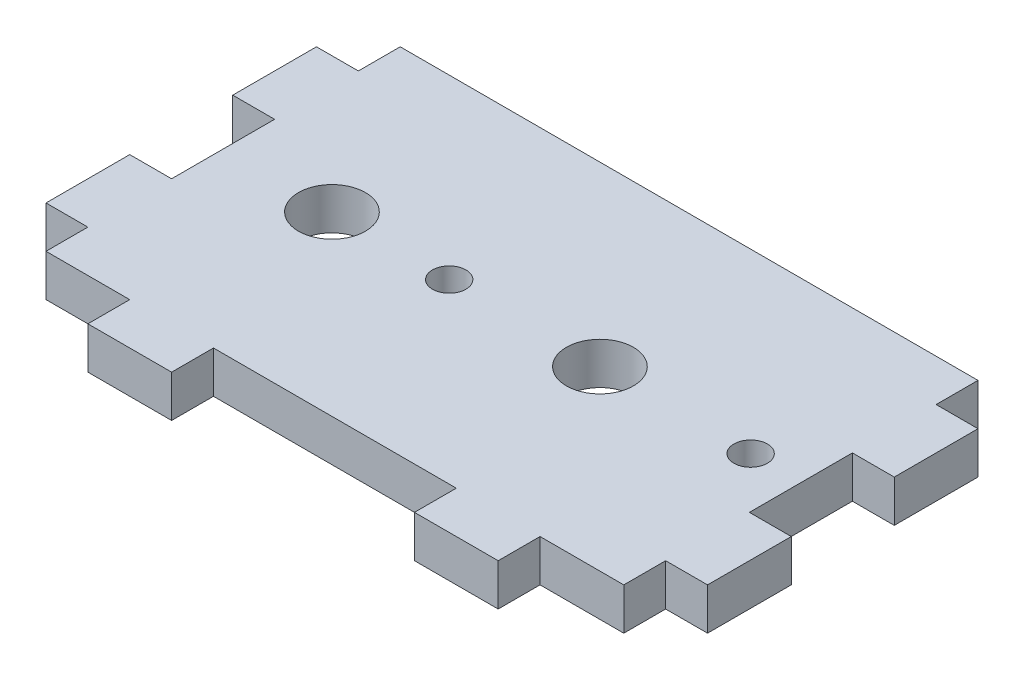
ISO-10303-21;
HEADER;
FILE_DESCRIPTION(('STEP AP214'),'2;1');
FILE_NAME('part.step','',(''),(''),'','','');
FILE_SCHEMA(('AUTOMOTIVE_DESIGN { 1 0 10303 214 1 1 1 1 }'));
ENDSEC;
DATA;
#1=APPLICATION_CONTEXT('core data for automotive mechanical design processes');
#2=APPLICATION_PROTOCOL_DEFINITION('international standard','automotive_design',2000,#1);
#3=PRODUCT_CONTEXT('',#1,'mechanical');
#4=PRODUCT('Part','Part','',(#3));
#5=PRODUCT_RELATED_PRODUCT_CATEGORY('part','',(#4));
#6=PRODUCT_DEFINITION_FORMATION('','',#4);
#7=PRODUCT_DEFINITION_CONTEXT('part definition',#1,'design');
#8=PRODUCT_DEFINITION('design','',#6,#7);
#9=PRODUCT_DEFINITION_SHAPE('','',#8);
#10=(LENGTH_UNIT() NAMED_UNIT(*) SI_UNIT(.MILLI.,.METRE.));
#11=(NAMED_UNIT(*) PLANE_ANGLE_UNIT() SI_UNIT($,.RADIAN.));
#12=(NAMED_UNIT(*) SI_UNIT($,.STERADIAN.) SOLID_ANGLE_UNIT());
#13=UNCERTAINTY_MEASURE_WITH_UNIT(LENGTH_MEASURE(1.E-05),#10,'distance_accuracy_value','');
#14=(GEOMETRIC_REPRESENTATION_CONTEXT(3) GLOBAL_UNCERTAINTY_ASSIGNED_CONTEXT((#13)) GLOBAL_UNIT_ASSIGNED_CONTEXT((#10,
#11,#12)) REPRESENTATION_CONTEXT('',''));
#15=CARTESIAN_POINT('',(0.,0.,0.));
#16=DIRECTION('',(0.,0.,1.));
#17=DIRECTION('',(1.,0.,0.));
#18=AXIS2_PLACEMENT_3D('',#15,#16,#17);
#19=CARTESIAN_POINT('',(0.,5.,0.));
#20=DIRECTION('',(0.,1.,0.));
#21=DIRECTION('',(0.,0.,1.));
#22=AXIS2_PLACEMENT_3D('',#19,#20,#21);
#23=PLANE('',#22);
#24=CARTESIAN_POINT('',(-7.5,5.,0.));
#25=DIRECTION('',(0.,1.,0.));
#26=DIRECTION('',(0.,0.,1.));
#27=AXIS2_PLACEMENT_3D('',#24,#25,#26);
#28=CIRCLE('',#27,2.);
#29=CARTESIAN_POINT('',(-7.5,5.,1.99999999999999));
#30=VERTEX_POINT('',#29);
#31=EDGE_CURVE('E500',#30,#30,#28,.T.);
#32=ORIENTED_EDGE('',*,*,#31,.F.);
#33=EDGE_LOOP('',(#32));
#34=FACE_BOUND('',#33,.T.);
#35=CARTESIAN_POINT('',(10.5,5.,0.));
#36=DIRECTION('',(0.,1.,0.));
#37=DIRECTION('',(0.,0.,1.));
#38=AXIS2_PLACEMENT_3D('',#35,#36,#37);
#39=CIRCLE('',#38,4.);
#40=CARTESIAN_POINT('',(10.5,5.,3.99999999999999));
#41=VERTEX_POINT('',#40);
#42=EDGE_CURVE('E255',#41,#41,#39,.T.);
#43=ORIENTED_EDGE('',*,*,#42,.F.);
#44=EDGE_LOOP('',(#43));
#45=FACE_BOUND('',#44,.T.);
#46=DIRECTION('',(0.,0.,-1.));
#47=VECTOR('',#46,1.);
#48=CARTESIAN_POINT('',(34.5,5.,16.15));
#49=LINE('',#48,#47);
#50=CARTESIAN_POINT('',(34.5,5.,21.15));
#51=VERTEX_POINT('',#50);
#52=CARTESIAN_POINT('',(34.5,5.,16.15));
#53=VERTEX_POINT('',#52);
#54=EDGE_CURVE('E306',#51,#53,#49,.T.);
#55=ORIENTED_EDGE('',*,*,#54,.T.);
#56=DIRECTION('',(1.,0.,0.));
#57=VECTOR('',#56,1.);
#58=CARTESIAN_POINT('',(34.5,5.,16.15));
#59=LINE('',#58,#57);
#60=CARTESIAN_POINT('',(39.5,5.,16.15));
#61=VERTEX_POINT('',#60);
#62=EDGE_CURVE('E154',#53,#61,#59,.T.);
#63=ORIENTED_EDGE('',*,*,#62,.T.);
#64=DIRECTION('',(0.,0.,-1.));
#65=VECTOR('',#64,1.);
#66=CARTESIAN_POINT('',(39.5,5.,16.15));
#67=LINE('',#66,#65);
#68=CARTESIAN_POINT('',(39.5,5.,6.15));
#69=VERTEX_POINT('',#68);
#70=EDGE_CURVE('E381',#61,#69,#67,.T.);
#71=ORIENTED_EDGE('',*,*,#70,.T.);
#72=DIRECTION('',(-1.,0.,0.));
#73=VECTOR('',#72,1.);
#74=CARTESIAN_POINT('',(34.5,5.,6.15));
#75=LINE('',#74,#73);
#76=CARTESIAN_POINT('',(34.5,5.,6.15));
#77=VERTEX_POINT('',#76);
#78=EDGE_CURVE('E400',#69,#77,#75,.T.);
#79=ORIENTED_EDGE('',*,*,#78,.T.);
#80=DIRECTION('',(0.,0.,-1.));
#81=VECTOR('',#80,1.);
#82=CARTESIAN_POINT('',(34.5,5.,-6.15));
#83=LINE('',#82,#81);
#84=CARTESIAN_POINT('',(34.5,5.,-6.15));
#85=VERTEX_POINT('',#84);
#86=EDGE_CURVE('E397',#77,#85,#83,.T.);
#87=ORIENTED_EDGE('',*,*,#86,.T.);
#88=DIRECTION('',(1.,0.,0.));
#89=VECTOR('',#88,1.);
#90=CARTESIAN_POINT('',(34.5,5.,-6.15));
#91=LINE('',#90,#89);
#92=CARTESIAN_POINT('',(39.5,5.,-6.15));
#93=VERTEX_POINT('',#92);
#94=EDGE_CURVE('E399',#85,#93,#91,.T.);
#95=ORIENTED_EDGE('',*,*,#94,.T.);
#96=DIRECTION('',(0.,0.,-1.));
#97=VECTOR('',#96,1.);
#98=CARTESIAN_POINT('',(39.5,5.,-16.15));
#99=LINE('',#98,#97);
#100=CARTESIAN_POINT('',(39.5,5.,-16.15));
#101=VERTEX_POINT('',#100);
#102=EDGE_CURVE('E402',#93,#101,#99,.T.);
#103=ORIENTED_EDGE('',*,*,#102,.T.);
#104=DIRECTION('',(-1.,0.,0.));
#105=VECTOR('',#104,1.);
#106=CARTESIAN_POINT('',(34.5,5.,-16.15));
#107=LINE('',#106,#105);
#108=CARTESIAN_POINT('',(34.5,5.,-16.15));
#109=VERTEX_POINT('',#108);
#110=EDGE_CURVE('E408',#101,#109,#107,.T.);
#111=ORIENTED_EDGE('',*,*,#110,.T.);
#112=DIRECTION('',(0.,0.,-1.));
#113=VECTOR('',#112,1.);
#114=CARTESIAN_POINT('',(34.5,5.,-21.15));
#115=LINE('',#114,#113);
#116=CARTESIAN_POINT('',(34.5,5.,-21.15));
#117=VERTEX_POINT('',#116);
#118=EDGE_CURVE('E410',#109,#117,#115,.T.);
#119=ORIENTED_EDGE('',*,*,#118,.T.);
#120=DIRECTION('',(-1.,0.,0.));
#121=VECTOR('',#120,1.);
#122=CARTESIAN_POINT('',(-34.5,5.,-21.15));
#123=LINE('',#122,#121);
#124=CARTESIAN_POINT('',(-34.5,5.,-21.15));
#125=VERTEX_POINT('',#124);
#126=EDGE_CURVE('E412',#117,#125,#123,.T.);
#127=ORIENTED_EDGE('',*,*,#126,.T.);
#128=DIRECTION('',(0.,0.,1.));
#129=VECTOR('',#128,1.);
#130=CARTESIAN_POINT('',(-34.5,5.,-21.15));
#131=LINE('',#130,#129);
#132=CARTESIAN_POINT('',(-34.5,5.,-16.15));
#133=VERTEX_POINT('',#132);
#134=EDGE_CURVE('E414',#125,#133,#131,.T.);
#135=ORIENTED_EDGE('',*,*,#134,.T.);
#136=DIRECTION('',(-1.,0.,0.));
#137=VECTOR('',#136,1.);
#138=CARTESIAN_POINT('',(-34.5,5.,-16.15));
#139=LINE('',#138,#137);
#140=CARTESIAN_POINT('',(-39.5,5.,-16.15));
#141=VERTEX_POINT('',#140);
#142=EDGE_CURVE('E416',#133,#141,#139,.T.);
#143=ORIENTED_EDGE('',*,*,#142,.T.);
#144=DIRECTION('',(0.,0.,1.));
#145=VECTOR('',#144,1.);
#146=CARTESIAN_POINT('',(-39.5,5.,-16.15));
#147=LINE('',#146,#145);
#148=CARTESIAN_POINT('',(-39.5,5.,-6.15));
#149=VERTEX_POINT('',#148);
#150=EDGE_CURVE('E418',#141,#149,#147,.T.);
#151=ORIENTED_EDGE('',*,*,#150,.T.);
#152=DIRECTION('',(1.,0.,0.));
#153=VECTOR('',#152,1.);
#154=CARTESIAN_POINT('',(-34.5,5.,-6.15));
#155=LINE('',#154,#153);
#156=CARTESIAN_POINT('',(-34.5,5.,-6.15));
#157=VERTEX_POINT('',#156);
#158=EDGE_CURVE('E420',#149,#157,#155,.T.);
#159=ORIENTED_EDGE('',*,*,#158,.T.);
#160=DIRECTION('',(0.,0.,1.));
#161=VECTOR('',#160,1.);
#162=CARTESIAN_POINT('',(-34.5,5.,-6.15));
#163=LINE('',#162,#161);
#164=CARTESIAN_POINT('',(-34.5,5.,6.15));
#165=VERTEX_POINT('',#164);
#166=EDGE_CURVE('E422',#157,#165,#163,.T.);
#167=ORIENTED_EDGE('',*,*,#166,.T.);
#168=DIRECTION('',(-1.,0.,0.));
#169=VECTOR('',#168,1.);
#170=CARTESIAN_POINT('',(-34.5,5.,6.15));
#171=LINE('',#170,#169);
#172=CARTESIAN_POINT('',(-39.5,5.,6.15));
#173=VERTEX_POINT('',#172);
#174=EDGE_CURVE('E424',#165,#173,#171,.T.);
#175=ORIENTED_EDGE('',*,*,#174,.T.);
#176=DIRECTION('',(0.,0.,1.));
#177=VECTOR('',#176,1.);
#178=CARTESIAN_POINT('',(-39.5,5.,16.15));
#179=LINE('',#178,#177);
#180=CARTESIAN_POINT('',(-39.5,5.,16.15));
#181=VERTEX_POINT('',#180);
#182=EDGE_CURVE('E426',#173,#181,#179,.T.);
#183=ORIENTED_EDGE('',*,*,#182,.T.);
#184=DIRECTION('',(1.,0.,0.));
#185=VECTOR('',#184,1.);
#186=CARTESIAN_POINT('',(-34.5,5.,16.15));
#187=LINE('',#186,#185);
#188=CARTESIAN_POINT('',(-34.5,5.,16.15));
#189=VERTEX_POINT('',#188);
#190=EDGE_CURVE('E428',#181,#189,#187,.T.);
#191=ORIENTED_EDGE('',*,*,#190,.T.);
#192=DIRECTION('',(0.,0.,1.));
#193=VECTOR('',#192,1.);
#194=CARTESIAN_POINT('',(-34.5,5.,16.15));
#195=LINE('',#194,#193);
#196=CARTESIAN_POINT('',(-34.5,5.,21.15));
#197=VERTEX_POINT('',#196);
#198=EDGE_CURVE('E430',#189,#197,#195,.T.);
#199=ORIENTED_EDGE('',*,*,#198,.T.);
#200=DIRECTION('',(1.,0.,0.));
#201=VECTOR('',#200,1.);
#202=CARTESIAN_POINT('',(-34.5,5.,21.15));
#203=LINE('',#202,#201);
#204=CARTESIAN_POINT('',(-24.5,5.,21.15));
#205=VERTEX_POINT('',#204);
#206=EDGE_CURVE('E432',#197,#205,#203,.T.);
#207=ORIENTED_EDGE('',*,*,#206,.T.);
#208=DIRECTION('',(0.,0.,1.));
#209=VECTOR('',#208,1.);
#210=CARTESIAN_POINT('',(-24.5,5.,21.15));
#211=LINE('',#210,#209);
#212=CARTESIAN_POINT('',(-24.5,5.,26.15));
#213=VERTEX_POINT('',#212);
#214=EDGE_CURVE('E434',#205,#213,#211,.T.);
#215=ORIENTED_EDGE('',*,*,#214,.T.);
#216=DIRECTION('',(1.,0.,0.));
#217=VECTOR('',#216,1.);
#218=CARTESIAN_POINT('',(-24.5,5.,26.15));
#219=LINE('',#218,#217);
#220=CARTESIAN_POINT('',(-14.5,5.,26.15));
#221=VERTEX_POINT('',#220);
#222=EDGE_CURVE('E436',#213,#221,#219,.T.);
#223=ORIENTED_EDGE('',*,*,#222,.T.);
#224=DIRECTION('',(0.,0.,-1.));
#225=VECTOR('',#224,1.);
#226=CARTESIAN_POINT('',(-14.5,5.,21.15));
#227=LINE('',#226,#225);
#228=CARTESIAN_POINT('',(-14.5,5.,21.15));
#229=VERTEX_POINT('',#228);
#230=EDGE_CURVE('E438',#221,#229,#227,.T.);
#231=ORIENTED_EDGE('',*,*,#230,.T.);
#232=DIRECTION('',(1.,0.,0.));
#233=VECTOR('',#232,1.);
#234=CARTESIAN_POINT('',(-14.5,5.,21.15));
#235=LINE('',#234,#233);
#236=CARTESIAN_POINT('',(14.5,5.,21.15));
#237=VERTEX_POINT('',#236);
#238=EDGE_CURVE('E440',#229,#237,#235,.T.);
#239=ORIENTED_EDGE('',*,*,#238,.T.);
#240=DIRECTION('',(0.,0.,1.));
#241=VECTOR('',#240,1.);
#242=CARTESIAN_POINT('',(14.5,5.,21.15));
#243=LINE('',#242,#241);
#244=CARTESIAN_POINT('',(14.5,5.,26.15));
#245=VERTEX_POINT('',#244);
#246=EDGE_CURVE('E233',#237,#245,#243,.T.);
#247=ORIENTED_EDGE('',*,*,#246,.T.);
#248=DIRECTION('',(1.,0.,0.));
#249=VECTOR('',#248,1.);
#250=CARTESIAN_POINT('',(14.5,5.,26.15));
#251=LINE('',#250,#249);
#252=CARTESIAN_POINT('',(24.5,5.,26.15));
#253=VERTEX_POINT('',#252);
#254=EDGE_CURVE('E227',#245,#253,#251,.T.);
#255=ORIENTED_EDGE('',*,*,#254,.T.);
#256=DIRECTION('',(0.,0.,-1.));
#257=VECTOR('',#256,1.);
#258=CARTESIAN_POINT('',(24.5,5.,21.15));
#259=LINE('',#258,#257);
#260=CARTESIAN_POINT('',(24.5,5.,21.15));
#261=VERTEX_POINT('',#260);
#262=EDGE_CURVE('E231',#253,#261,#259,.T.);
#263=ORIENTED_EDGE('',*,*,#262,.T.);
#264=DIRECTION('',(1.,0.,0.));
#265=VECTOR('',#264,1.);
#266=CARTESIAN_POINT('',(24.5,5.,21.15));
#267=LINE('',#266,#265);
#268=EDGE_CURVE('E51',#261,#51,#267,.T.);
#269=ORIENTED_EDGE('',*,*,#268,.T.);
#270=EDGE_LOOP('',(#55,#63,#71,#79,#87,#95,#103,#111,#119,#127,#135,#143,#151,#159,#167,#175,
#183,#191,#199,#207,#215,#223,#231,#239,#247,#255,#263,#269));
#271=FACE_BOUND('',#270,.T.);
#272=CARTESIAN_POINT('',(-21.5,5.,0.));
#273=DIRECTION('',(0.,1.,0.));
#274=DIRECTION('',(0.,0.,1.));
#275=AXIS2_PLACEMENT_3D('',#272,#273,#274);
#276=CIRCLE('',#275,4.);
#277=CARTESIAN_POINT('',(-21.5,5.,3.99999999999999));
#278=VERTEX_POINT('',#277);
#279=EDGE_CURVE('E506',#278,#278,#276,.T.);
#280=ORIENTED_EDGE('',*,*,#279,.F.);
#281=EDGE_LOOP('',(#280));
#282=FACE_BOUND('',#281,.T.);
#283=CARTESIAN_POINT('',(28.5,5.,0.));
#284=DIRECTION('',(0.,1.,0.));
#285=DIRECTION('',(0.,0.,1.));
#286=AXIS2_PLACEMENT_3D('',#283,#284,#285);
#287=CIRCLE('',#286,2.);
#288=CARTESIAN_POINT('',(28.5,5.,1.99999999999999));
#289=VERTEX_POINT('',#288);
#290=EDGE_CURVE('E491',#289,#289,#287,.T.);
#291=ORIENTED_EDGE('',*,*,#290,.F.);
#292=EDGE_LOOP('',(#291));
#293=FACE_BOUND('',#292,.T.);
#294=ADVANCED_FACE('F34',(#34,#45,#271,#282,#293),#23,.T.);
#295=CARTESIAN_POINT('',(0.,0.,0.));
#296=DIRECTION('',(0.,1.,0.));
#297=DIRECTION('',(0.,0.,1.));
#298=AXIS2_PLACEMENT_3D('',#295,#296,#297);
#299=PLANE('',#298);
#300=DIRECTION('',(0.,0.,-1.));
#301=VECTOR('',#300,1.);
#302=CARTESIAN_POINT('',(34.5,0.,16.15));
#303=LINE('',#302,#301);
#304=CARTESIAN_POINT('',(34.5,0.,21.15));
#305=VERTEX_POINT('',#304);
#306=CARTESIAN_POINT('',(34.5,0.,16.15));
#307=VERTEX_POINT('',#306);
#308=EDGE_CURVE('E251',#305,#307,#303,.T.);
#309=ORIENTED_EDGE('',*,*,#308,.F.);
#310=DIRECTION('',(1.,0.,0.));
#311=VECTOR('',#310,1.);
#312=CARTESIAN_POINT('',(24.5,0.,21.15));
#313=LINE('',#312,#311);
#314=CARTESIAN_POINT('',(24.5,0.,21.15));
#315=VERTEX_POINT('',#314);
#316=EDGE_CURVE('E146',#315,#305,#313,.T.);
#317=ORIENTED_EDGE('',*,*,#316,.F.);
#318=DIRECTION('',(0.,0.,-1.));
#319=VECTOR('',#318,1.);
#320=CARTESIAN_POINT('',(24.5,0.,21.15));
#321=LINE('',#320,#319);
#322=CARTESIAN_POINT('',(24.5,0.,26.15));
#323=VERTEX_POINT('',#322);
#324=EDGE_CURVE('E140',#323,#315,#321,.T.);
#325=ORIENTED_EDGE('',*,*,#324,.F.);
#326=DIRECTION('',(1.,0.,0.));
#327=VECTOR('',#326,1.);
#328=CARTESIAN_POINT('',(14.5,0.,26.15));
#329=LINE('',#328,#327);
#330=CARTESIAN_POINT('',(14.5,0.,26.15));
#331=VERTEX_POINT('',#330);
#332=EDGE_CURVE('E241',#331,#323,#329,.T.);
#333=ORIENTED_EDGE('',*,*,#332,.F.);
#334=DIRECTION('',(0.,0.,1.));
#335=VECTOR('',#334,1.);
#336=CARTESIAN_POINT('',(14.5,0.,21.15));
#337=LINE('',#336,#335);
#338=CARTESIAN_POINT('',(14.5,0.,21.15));
#339=VERTEX_POINT('',#338);
#340=EDGE_CURVE('E301',#339,#331,#337,.T.);
#341=ORIENTED_EDGE('',*,*,#340,.F.);
#342=DIRECTION('',(1.,0.,0.));
#343=VECTOR('',#342,1.);
#344=CARTESIAN_POINT('',(-14.5,0.,21.15));
#345=LINE('',#344,#343);
#346=CARTESIAN_POINT('',(-14.5,0.,21.15));
#347=VERTEX_POINT('',#346);
#348=EDGE_CURVE('E299',#347,#339,#345,.T.);
#349=ORIENTED_EDGE('',*,*,#348,.F.);
#350=DIRECTION('',(0.,0.,-1.));
#351=VECTOR('',#350,1.);
#352=CARTESIAN_POINT('',(-14.5,0.,21.15));
#353=LINE('',#352,#351);
#354=CARTESIAN_POINT('',(-14.5,0.,26.15));
#355=VERTEX_POINT('',#354);
#356=EDGE_CURVE('E297',#355,#347,#353,.T.);
#357=ORIENTED_EDGE('',*,*,#356,.F.);
#358=DIRECTION('',(1.,0.,0.));
#359=VECTOR('',#358,1.);
#360=CARTESIAN_POINT('',(-24.5,0.,26.15));
#361=LINE('',#360,#359);
#362=CARTESIAN_POINT('',(-24.5,0.,26.15));
#363=VERTEX_POINT('',#362);
#364=EDGE_CURVE('E295',#363,#355,#361,.T.);
#365=ORIENTED_EDGE('',*,*,#364,.F.);
#366=DIRECTION('',(0.,0.,1.));
#367=VECTOR('',#366,1.);
#368=CARTESIAN_POINT('',(-24.5,0.,21.15));
#369=LINE('',#368,#367);
#370=CARTESIAN_POINT('',(-24.5,0.,21.15));
#371=VERTEX_POINT('',#370);
#372=EDGE_CURVE('E293',#371,#363,#369,.T.);
#373=ORIENTED_EDGE('',*,*,#372,.F.);
#374=DIRECTION('',(1.,0.,0.));
#375=VECTOR('',#374,1.);
#376=CARTESIAN_POINT('',(-34.5,0.,21.15));
#377=LINE('',#376,#375);
#378=CARTESIAN_POINT('',(-34.5,0.,21.15));
#379=VERTEX_POINT('',#378);
#380=EDGE_CURVE('E291',#379,#371,#377,.T.);
#381=ORIENTED_EDGE('',*,*,#380,.F.);
#382=DIRECTION('',(0.,0.,1.));
#383=VECTOR('',#382,1.);
#384=CARTESIAN_POINT('',(-34.5,0.,16.15));
#385=LINE('',#384,#383);
#386=CARTESIAN_POINT('',(-34.5,0.,16.15));
#387=VERTEX_POINT('',#386);
#388=EDGE_CURVE('E289',#387,#379,#385,.T.);
#389=ORIENTED_EDGE('',*,*,#388,.F.);
#390=DIRECTION('',(1.,0.,0.));
#391=VECTOR('',#390,1.);
#392=CARTESIAN_POINT('',(-34.5,0.,16.15));
#393=LINE('',#392,#391);
#394=CARTESIAN_POINT('',(-39.5,0.,16.15));
#395=VERTEX_POINT('',#394);
#396=EDGE_CURVE('E287',#395,#387,#393,.T.);
#397=ORIENTED_EDGE('',*,*,#396,.F.);
#398=DIRECTION('',(0.,0.,1.));
#399=VECTOR('',#398,1.);
#400=CARTESIAN_POINT('',(-39.5,0.,16.15));
#401=LINE('',#400,#399);
#402=CARTESIAN_POINT('',(-39.5,0.,6.15));
#403=VERTEX_POINT('',#402);
#404=EDGE_CURVE('E285',#403,#395,#401,.T.);
#405=ORIENTED_EDGE('',*,*,#404,.F.);
#406=DIRECTION('',(-1.,0.,0.));
#407=VECTOR('',#406,1.);
#408=CARTESIAN_POINT('',(-34.5,0.,6.15));
#409=LINE('',#408,#407);
#410=CARTESIAN_POINT('',(-34.5,0.,6.15));
#411=VERTEX_POINT('',#410);
#412=EDGE_CURVE('E283',#411,#403,#409,.T.);
#413=ORIENTED_EDGE('',*,*,#412,.F.);
#414=DIRECTION('',(0.,0.,1.));
#415=VECTOR('',#414,1.);
#416=CARTESIAN_POINT('',(-34.5,0.,-6.15));
#417=LINE('',#416,#415);
#418=CARTESIAN_POINT('',(-34.5,0.,-6.15));
#419=VERTEX_POINT('',#418);
#420=EDGE_CURVE('E281',#419,#411,#417,.T.);
#421=ORIENTED_EDGE('',*,*,#420,.F.);
#422=DIRECTION('',(1.,0.,0.));
#423=VECTOR('',#422,1.);
#424=CARTESIAN_POINT('',(-34.5,0.,-6.15));
#425=LINE('',#424,#423);
#426=CARTESIAN_POINT('',(-39.5,0.,-6.15));
#427=VERTEX_POINT('',#426);
#428=EDGE_CURVE('E279',#427,#419,#425,.T.);
#429=ORIENTED_EDGE('',*,*,#428,.F.);
#430=DIRECTION('',(0.,0.,1.));
#431=VECTOR('',#430,1.);
#432=CARTESIAN_POINT('',(-39.5,0.,-16.15));
#433=LINE('',#432,#431);
#434=CARTESIAN_POINT('',(-39.5,0.,-16.15));
#435=VERTEX_POINT('',#434);
#436=EDGE_CURVE('E277',#435,#427,#433,.T.);
#437=ORIENTED_EDGE('',*,*,#436,.F.);
#438=DIRECTION('',(-1.,0.,0.));
#439=VECTOR('',#438,1.);
#440=CARTESIAN_POINT('',(-34.5,0.,-16.15));
#441=LINE('',#440,#439);
#442=CARTESIAN_POINT('',(-34.5,0.,-16.15));
#443=VERTEX_POINT('',#442);
#444=EDGE_CURVE('E275',#443,#435,#441,.T.);
#445=ORIENTED_EDGE('',*,*,#444,.F.);
#446=DIRECTION('',(0.,0.,1.));
#447=VECTOR('',#446,1.);
#448=CARTESIAN_POINT('',(-34.5,0.,-21.15));
#449=LINE('',#448,#447);
#450=CARTESIAN_POINT('',(-34.5,0.,-21.15));
#451=VERTEX_POINT('',#450);
#452=EDGE_CURVE('E273',#451,#443,#449,.T.);
#453=ORIENTED_EDGE('',*,*,#452,.F.);
#454=DIRECTION('',(-1.,0.,0.));
#455=VECTOR('',#454,1.);
#456=CARTESIAN_POINT('',(-34.5,0.,-21.15));
#457=LINE('',#456,#455);
#458=CARTESIAN_POINT('',(34.5,0.,-21.15));
#459=VERTEX_POINT('',#458);
#460=EDGE_CURVE('E271',#459,#451,#457,.T.);
#461=ORIENTED_EDGE('',*,*,#460,.F.);
#462=DIRECTION('',(0.,0.,-1.));
#463=VECTOR('',#462,1.);
#464=CARTESIAN_POINT('',(34.5,0.,-21.15));
#465=LINE('',#464,#463);
#466=CARTESIAN_POINT('',(34.5,0.,-16.15));
#467=VERTEX_POINT('',#466);
#468=EDGE_CURVE('E269',#467,#459,#465,.T.);
#469=ORIENTED_EDGE('',*,*,#468,.F.);
#470=DIRECTION('',(-1.,0.,0.));
#471=VECTOR('',#470,1.);
#472=CARTESIAN_POINT('',(34.5,0.,-16.15));
#473=LINE('',#472,#471);
#474=CARTESIAN_POINT('',(39.5,0.,-16.15));
#475=VERTEX_POINT('',#474);
#476=EDGE_CURVE('E267',#475,#467,#473,.T.);
#477=ORIENTED_EDGE('',*,*,#476,.F.);
#478=DIRECTION('',(0.,0.,-1.));
#479=VECTOR('',#478,1.);
#480=CARTESIAN_POINT('',(39.5,0.,-16.15));
#481=LINE('',#480,#479);
#482=CARTESIAN_POINT('',(39.5,0.,-6.15));
#483=VERTEX_POINT('',#482);
#484=EDGE_CURVE('E265',#483,#475,#481,.T.);
#485=ORIENTED_EDGE('',*,*,#484,.F.);
#486=DIRECTION('',(1.,0.,0.));
#487=VECTOR('',#486,1.);
#488=CARTESIAN_POINT('',(34.5,0.,-6.15));
#489=LINE('',#488,#487);
#490=CARTESIAN_POINT('',(34.5,0.,-6.15));
#491=VERTEX_POINT('',#490);
#492=EDGE_CURVE('E263',#491,#483,#489,.T.);
#493=ORIENTED_EDGE('',*,*,#492,.F.);
#494=DIRECTION('',(0.,0.,-1.));
#495=VECTOR('',#494,1.);
#496=CARTESIAN_POINT('',(34.5,0.,-6.15));
#497=LINE('',#496,#495);
#498=CARTESIAN_POINT('',(34.5,0.,6.15));
#499=VERTEX_POINT('',#498);
#500=EDGE_CURVE('E261',#499,#491,#497,.T.);
#501=ORIENTED_EDGE('',*,*,#500,.F.);
#502=DIRECTION('',(-1.,0.,0.));
#503=VECTOR('',#502,1.);
#504=CARTESIAN_POINT('',(34.5,0.,6.15));
#505=LINE('',#504,#503);
#506=CARTESIAN_POINT('',(39.5,0.,6.15));
#507=VERTEX_POINT('',#506);
#508=EDGE_CURVE('E259',#507,#499,#505,.T.);
#509=ORIENTED_EDGE('',*,*,#508,.F.);
#510=DIRECTION('',(0.,0.,-1.));
#511=VECTOR('',#510,1.);
#512=CARTESIAN_POINT('',(39.5,0.,16.15));
#513=LINE('',#512,#511);
#514=CARTESIAN_POINT('',(39.5,0.,16.15));
#515=VERTEX_POINT('',#514);
#516=EDGE_CURVE('E257',#515,#507,#513,.T.);
#517=ORIENTED_EDGE('',*,*,#516,.F.);
#518=DIRECTION('',(1.,0.,0.));
#519=VECTOR('',#518,1.);
#520=CARTESIAN_POINT('',(34.5,0.,16.15));
#521=LINE('',#520,#519);
#522=EDGE_CURVE('E254',#307,#515,#521,.T.);
#523=ORIENTED_EDGE('',*,*,#522,.F.);
#524=EDGE_LOOP('',(#309,#317,#325,#333,#341,#349,#357,#365,#373,#381,#389,#397,#405,#413,#421,
#429,#437,#445,#453,#461,#469,#477,#485,#493,#501,#509,#517,#523));
#525=FACE_BOUND('',#524,.T.);
#526=CARTESIAN_POINT('',(10.5,0.,0.));
#527=DIRECTION('',(0.,1.,0.));
#528=DIRECTION('',(0.,0.,1.));
#529=AXIS2_PLACEMENT_3D('',#526,#527,#528);
#530=CIRCLE('',#529,4.);
#531=CARTESIAN_POINT('',(10.5,0.,3.99999999999999));
#532=VERTEX_POINT('',#531);
#533=EDGE_CURVE('E509',#532,#532,#530,.T.);
#534=ORIENTED_EDGE('',*,*,#533,.T.);
#535=EDGE_LOOP('',(#534));
#536=FACE_BOUND('',#535,.T.);
#537=CARTESIAN_POINT('',(-21.5,0.,0.));
#538=DIRECTION('',(0.,1.,0.));
#539=DIRECTION('',(0.,0.,1.));
#540=AXIS2_PLACEMENT_3D('',#537,#538,#539);
#541=CIRCLE('',#540,4.);
#542=CARTESIAN_POINT('',(-21.5,0.,3.99999999999999));
#543=VERTEX_POINT('',#542);
#544=EDGE_CURVE('E503',#543,#543,#541,.T.);
#545=ORIENTED_EDGE('',*,*,#544,.T.);
#546=EDGE_LOOP('',(#545));
#547=FACE_BOUND('',#546,.T.);
#548=CARTESIAN_POINT('',(-7.5,0.,0.));
#549=DIRECTION('',(0.,1.,0.));
#550=DIRECTION('',(0.,0.,1.));
#551=AXIS2_PLACEMENT_3D('',#548,#549,#550);
#552=CIRCLE('',#551,2.);
#553=CARTESIAN_POINT('',(-7.5,0.,1.99999999999999));
#554=VERTEX_POINT('',#553);
#555=EDGE_CURVE('E497',#554,#554,#552,.T.);
#556=ORIENTED_EDGE('',*,*,#555,.T.);
#557=EDGE_LOOP('',(#556));
#558=FACE_BOUND('',#557,.T.);
#559=CARTESIAN_POINT('',(28.5,0.,0.));
#560=DIRECTION('',(0.,1.,0.));
#561=DIRECTION('',(0.,0.,1.));
#562=AXIS2_PLACEMENT_3D('',#559,#560,#561);
#563=CIRCLE('',#562,2.);
#564=CARTESIAN_POINT('',(28.5,0.,1.99999999999999));
#565=VERTEX_POINT('',#564);
#566=EDGE_CURVE('E494',#565,#565,#563,.T.);
#567=ORIENTED_EDGE('',*,*,#566,.T.);
#568=EDGE_LOOP('',(#567));
#569=FACE_BOUND('',#568,.T.);
#570=ADVANCED_FACE('F385',(#525,#536,#547,#558,#569),#299,.F.);
#571=CARTESIAN_POINT('',(34.5,5.,16.15));
#572=DIRECTION('',(-1.,0.,0.));
#573=DIRECTION('',(0.,0.,1.));
#574=AXIS2_PLACEMENT_3D('',#571,#572,#573);
#575=PLANE('',#574);
#576=ORIENTED_EDGE('',*,*,#308,.T.);
#577=DIRECTION('',(0.,-1.,0.));
#578=VECTOR('',#577,1.);
#579=CARTESIAN_POINT('',(34.5,5.,16.15));
#580=LINE('',#579,#578);
#581=EDGE_CURVE('E11',#53,#307,#580,.T.);
#582=ORIENTED_EDGE('',*,*,#581,.F.);
#583=ORIENTED_EDGE('',*,*,#54,.F.);
#584=DIRECTION('',(0.,-1.,0.));
#585=VECTOR('',#584,1.);
#586=CARTESIAN_POINT('',(34.5,5.,21.15));
#587=LINE('',#586,#585);
#588=EDGE_CURVE('E247',#51,#305,#587,.T.);
#589=ORIENTED_EDGE('',*,*,#588,.T.);
#590=EDGE_LOOP('',(#576,#582,#583,#589));
#591=FACE_BOUND('',#590,.T.);
#592=ADVANCED_FACE('F36',(#591),#575,.F.);
#593=CARTESIAN_POINT('',(34.5,5.,16.15));
#594=DIRECTION('',(0.,0.,-1.));
#595=DIRECTION('',(-1.,0.,0.));
#596=AXIS2_PLACEMENT_3D('',#593,#594,#595);
#597=PLANE('',#596);
#598=ORIENTED_EDGE('',*,*,#522,.T.);
#599=DIRECTION('',(0.,-1.,0.));
#600=VECTOR('',#599,1.);
#601=CARTESIAN_POINT('',(39.5,5.,16.15));
#602=LINE('',#601,#600);
#603=EDGE_CURVE('E43',#61,#515,#602,.T.);
#604=ORIENTED_EDGE('',*,*,#603,.F.);
#605=ORIENTED_EDGE('',*,*,#62,.F.);
#606=ORIENTED_EDGE('',*,*,#581,.T.);
#607=EDGE_LOOP('',(#598,#604,#605,#606));
#608=FACE_BOUND('',#607,.T.);
#609=ADVANCED_FACE('F779',(#608),#597,.F.);
#610=CARTESIAN_POINT('',(39.5,5.,16.15));
#611=DIRECTION('',(-1.,0.,0.));
#612=DIRECTION('',(0.,0.,1.));
#613=AXIS2_PLACEMENT_3D('',#610,#611,#612);
#614=PLANE('',#613);
#615=ORIENTED_EDGE('',*,*,#516,.T.);
#616=DIRECTION('',(0.,-1.,0.));
#617=VECTOR('',#616,1.);
#618=CARTESIAN_POINT('',(39.5,5.,6.15));
#619=LINE('',#618,#617);
#620=EDGE_CURVE('E373',#69,#507,#619,.T.);
#621=ORIENTED_EDGE('',*,*,#620,.F.);
#622=ORIENTED_EDGE('',*,*,#70,.F.);
#623=ORIENTED_EDGE('',*,*,#603,.T.);
#624=EDGE_LOOP('',(#615,#621,#622,#623));
#625=FACE_BOUND('',#624,.T.);
#626=ADVANCED_FACE('F379',(#625),#614,.F.);
#627=CARTESIAN_POINT('',(34.5,5.,6.15));
#628=DIRECTION('',(0.,0.,1.));
#629=DIRECTION('',(1.,0.,0.));
#630=AXIS2_PLACEMENT_3D('',#627,#628,#629);
#631=PLANE('',#630);
#632=ORIENTED_EDGE('',*,*,#508,.T.);
#633=DIRECTION('',(0.,-1.,0.));
#634=VECTOR('',#633,1.);
#635=CARTESIAN_POINT('',(34.5,5.,6.15));
#636=LINE('',#635,#634);
#637=EDGE_CURVE('E370',#77,#499,#636,.T.);
#638=ORIENTED_EDGE('',*,*,#637,.F.);
#639=ORIENTED_EDGE('',*,*,#78,.F.);
#640=ORIENTED_EDGE('',*,*,#620,.T.);
#641=EDGE_LOOP('',(#632,#638,#639,#640));
#642=FACE_BOUND('',#641,.T.);
#643=ADVANCED_FACE('F391',(#642),#631,.F.);
#644=CARTESIAN_POINT('',(34.5,5.,-6.15));
#645=DIRECTION('',(-1.,0.,0.));
#646=DIRECTION('',(0.,0.,1.));
#647=AXIS2_PLACEMENT_3D('',#644,#645,#646);
#648=PLANE('',#647);
#649=ORIENTED_EDGE('',*,*,#500,.T.);
#650=DIRECTION('',(0.,-1.,0.));
#651=VECTOR('',#650,1.);
#652=CARTESIAN_POINT('',(34.5,5.,-6.15));
#653=LINE('',#652,#651);
#654=EDGE_CURVE('E367',#85,#491,#653,.T.);
#655=ORIENTED_EDGE('',*,*,#654,.F.);
#656=ORIENTED_EDGE('',*,*,#86,.F.);
#657=ORIENTED_EDGE('',*,*,#637,.T.);
#658=EDGE_LOOP('',(#649,#655,#656,#657));
#659=FACE_BOUND('',#658,.T.);
#660=ADVANCED_FACE('F395',(#659),#648,.F.);
#661=CARTESIAN_POINT('',(34.5,5.,-6.15));
#662=DIRECTION('',(0.,0.,-1.));
#663=DIRECTION('',(-1.,0.,0.));
#664=AXIS2_PLACEMENT_3D('',#661,#662,#663);
#665=PLANE('',#664);
#666=ORIENTED_EDGE('',*,*,#492,.T.);
#667=DIRECTION('',(0.,-1.,0.));
#668=VECTOR('',#667,1.);
#669=CARTESIAN_POINT('',(39.5,5.,-6.15));
#670=LINE('',#669,#668);
#671=EDGE_CURVE('E364',#93,#483,#670,.T.);
#672=ORIENTED_EDGE('',*,*,#671,.F.);
#673=ORIENTED_EDGE('',*,*,#94,.F.);
#674=ORIENTED_EDGE('',*,*,#654,.T.);
#675=EDGE_LOOP('',(#666,#672,#673,#674));
#676=FACE_BOUND('',#675,.T.);
#677=ADVANCED_FACE('F744',(#676),#665,.F.);
#678=CARTESIAN_POINT('',(39.5,5.,-16.15));
#679=DIRECTION('',(-1.,0.,0.));
#680=DIRECTION('',(0.,0.,1.));
#681=AXIS2_PLACEMENT_3D('',#678,#679,#680);
#682=PLANE('',#681);
#683=ORIENTED_EDGE('',*,*,#484,.T.);
#684=DIRECTION('',(0.,-1.,0.));
#685=VECTOR('',#684,1.);
#686=CARTESIAN_POINT('',(39.5,5.,-16.15));
#687=LINE('',#686,#685);
#688=EDGE_CURVE('E361',#101,#475,#687,.T.);
#689=ORIENTED_EDGE('',*,*,#688,.F.);
#690=ORIENTED_EDGE('',*,*,#102,.F.);
#691=ORIENTED_EDGE('',*,*,#671,.T.);
#692=EDGE_LOOP('',(#683,#689,#690,#691));
#693=FACE_BOUND('',#692,.T.);
#694=ADVANCED_FACE('F734',(#693),#682,.F.);
#695=CARTESIAN_POINT('',(34.5,5.,-16.15));
#696=DIRECTION('',(0.,0.,1.));
#697=DIRECTION('',(1.,0.,0.));
#698=AXIS2_PLACEMENT_3D('',#695,#696,#697);
#699=PLANE('',#698);
#700=ORIENTED_EDGE('',*,*,#476,.T.);
#701=DIRECTION('',(0.,-1.,0.));
#702=VECTOR('',#701,1.);
#703=CARTESIAN_POINT('',(34.5,5.,-16.15));
#704=LINE('',#703,#702);
#705=EDGE_CURVE('E358',#109,#467,#704,.T.);
#706=ORIENTED_EDGE('',*,*,#705,.F.);
#707=ORIENTED_EDGE('',*,*,#110,.F.);
#708=ORIENTED_EDGE('',*,*,#688,.T.);
#709=EDGE_LOOP('',(#700,#706,#707,#708));
#710=FACE_BOUND('',#709,.T.);
#711=ADVANCED_FACE('F724',(#710),#699,.F.);
#712=CARTESIAN_POINT('',(34.5,5.,-21.15));
#713=DIRECTION('',(-1.,0.,0.));
#714=DIRECTION('',(0.,0.,1.));
#715=AXIS2_PLACEMENT_3D('',#712,#713,#714);
#716=PLANE('',#715);
#717=ORIENTED_EDGE('',*,*,#468,.T.);
#718=DIRECTION('',(0.,-1.,0.));
#719=VECTOR('',#718,1.);
#720=CARTESIAN_POINT('',(34.5,5.,-21.15));
#721=LINE('',#720,#719);
#722=EDGE_CURVE('E355',#117,#459,#721,.T.);
#723=ORIENTED_EDGE('',*,*,#722,.F.);
#724=ORIENTED_EDGE('',*,*,#118,.F.);
#725=ORIENTED_EDGE('',*,*,#705,.T.);
#726=EDGE_LOOP('',(#717,#723,#724,#725));
#727=FACE_BOUND('',#726,.T.);
#728=ADVANCED_FACE('F714',(#727),#716,.F.);
#729=CARTESIAN_POINT('',(-34.5,5.,-21.15));
#730=DIRECTION('',(0.,0.,1.));
#731=DIRECTION('',(1.,0.,0.));
#732=AXIS2_PLACEMENT_3D('',#729,#730,#731);
#733=PLANE('',#732);
#734=ORIENTED_EDGE('',*,*,#460,.T.);
#735=DIRECTION('',(0.,-1.,0.));
#736=VECTOR('',#735,1.);
#737=CARTESIAN_POINT('',(-34.5,5.,-21.15));
#738=LINE('',#737,#736);
#739=EDGE_CURVE('E352',#125,#451,#738,.T.);
#740=ORIENTED_EDGE('',*,*,#739,.F.);
#741=ORIENTED_EDGE('',*,*,#126,.F.);
#742=ORIENTED_EDGE('',*,*,#722,.T.);
#743=EDGE_LOOP('',(#734,#740,#741,#742));
#744=FACE_BOUND('',#743,.T.);
#745=ADVANCED_FACE('F704',(#744),#733,.F.);
#746=CARTESIAN_POINT('',(-34.5,5.,-21.15));
#747=DIRECTION('',(1.,0.,0.));
#748=DIRECTION('',(0.,0.,-1.));
#749=AXIS2_PLACEMENT_3D('',#746,#747,#748);
#750=PLANE('',#749);
#751=ORIENTED_EDGE('',*,*,#452,.T.);
#752=DIRECTION('',(0.,-1.,0.));
#753=VECTOR('',#752,1.);
#754=CARTESIAN_POINT('',(-34.5,5.,-16.15));
#755=LINE('',#754,#753);
#756=EDGE_CURVE('E349',#133,#443,#755,.T.);
#757=ORIENTED_EDGE('',*,*,#756,.F.);
#758=ORIENTED_EDGE('',*,*,#134,.F.);
#759=ORIENTED_EDGE('',*,*,#739,.T.);
#760=EDGE_LOOP('',(#751,#757,#758,#759));
#761=FACE_BOUND('',#760,.T.);
#762=ADVANCED_FACE('F694',(#761),#750,.F.);
#763=CARTESIAN_POINT('',(-34.5,5.,-16.15));
#764=DIRECTION('',(0.,0.,1.));
#765=DIRECTION('',(1.,0.,0.));
#766=AXIS2_PLACEMENT_3D('',#763,#764,#765);
#767=PLANE('',#766);
#768=ORIENTED_EDGE('',*,*,#444,.T.);
#769=DIRECTION('',(0.,-1.,0.));
#770=VECTOR('',#769,1.);
#771=CARTESIAN_POINT('',(-39.5,5.,-16.15));
#772=LINE('',#771,#770);
#773=EDGE_CURVE('E346',#141,#435,#772,.T.);
#774=ORIENTED_EDGE('',*,*,#773,.F.);
#775=ORIENTED_EDGE('',*,*,#142,.F.);
#776=ORIENTED_EDGE('',*,*,#756,.T.);
#777=EDGE_LOOP('',(#768,#774,#775,#776));
#778=FACE_BOUND('',#777,.T.);
#779=ADVANCED_FACE('F684',(#778),#767,.F.);
#780=CARTESIAN_POINT('',(-39.5,5.,-16.15));
#781=DIRECTION('',(1.,0.,0.));
#782=DIRECTION('',(0.,0.,-1.));
#783=AXIS2_PLACEMENT_3D('',#780,#781,#782);
#784=PLANE('',#783);
#785=ORIENTED_EDGE('',*,*,#436,.T.);
#786=DIRECTION('',(0.,-1.,0.));
#787=VECTOR('',#786,1.);
#788=CARTESIAN_POINT('',(-39.5,5.,-6.15));
#789=LINE('',#788,#787);
#790=EDGE_CURVE('E343',#149,#427,#789,.T.);
#791=ORIENTED_EDGE('',*,*,#790,.F.);
#792=ORIENTED_EDGE('',*,*,#150,.F.);
#793=ORIENTED_EDGE('',*,*,#773,.T.);
#794=EDGE_LOOP('',(#785,#791,#792,#793));
#795=FACE_BOUND('',#794,.T.);
#796=ADVANCED_FACE('F674',(#795),#784,.F.);
#797=CARTESIAN_POINT('',(-34.5,5.,-6.15));
#798=DIRECTION('',(0.,0.,-1.));
#799=DIRECTION('',(-1.,0.,0.));
#800=AXIS2_PLACEMENT_3D('',#797,#798,#799);
#801=PLANE('',#800);
#802=ORIENTED_EDGE('',*,*,#428,.T.);
#803=DIRECTION('',(0.,-1.,0.));
#804=VECTOR('',#803,1.);
#805=CARTESIAN_POINT('',(-34.5,5.,-6.15));
#806=LINE('',#805,#804);
#807=EDGE_CURVE('E340',#157,#419,#806,.T.);
#808=ORIENTED_EDGE('',*,*,#807,.F.);
#809=ORIENTED_EDGE('',*,*,#158,.F.);
#810=ORIENTED_EDGE('',*,*,#790,.T.);
#811=EDGE_LOOP('',(#802,#808,#809,#810));
#812=FACE_BOUND('',#811,.T.);
#813=ADVANCED_FACE('F664',(#812),#801,.F.);
#814=CARTESIAN_POINT('',(-34.5,5.,-6.15));
#815=DIRECTION('',(1.,0.,0.));
#816=DIRECTION('',(0.,0.,-1.));
#817=AXIS2_PLACEMENT_3D('',#814,#815,#816);
#818=PLANE('',#817);
#819=ORIENTED_EDGE('',*,*,#420,.T.);
#820=DIRECTION('',(0.,-1.,0.));
#821=VECTOR('',#820,1.);
#822=CARTESIAN_POINT('',(-34.5,5.,6.15));
#823=LINE('',#822,#821);
#824=EDGE_CURVE('E337',#165,#411,#823,.T.);
#825=ORIENTED_EDGE('',*,*,#824,.F.);
#826=ORIENTED_EDGE('',*,*,#166,.F.);
#827=ORIENTED_EDGE('',*,*,#807,.T.);
#828=EDGE_LOOP('',(#819,#825,#826,#827));
#829=FACE_BOUND('',#828,.T.);
#830=ADVANCED_FACE('F654',(#829),#818,.F.);
#831=CARTESIAN_POINT('',(-34.5,5.,6.15));
#832=DIRECTION('',(0.,0.,1.));
#833=DIRECTION('',(1.,0.,0.));
#834=AXIS2_PLACEMENT_3D('',#831,#832,#833);
#835=PLANE('',#834);
#836=ORIENTED_EDGE('',*,*,#412,.T.);
#837=DIRECTION('',(0.,-1.,0.));
#838=VECTOR('',#837,1.);
#839=CARTESIAN_POINT('',(-39.5,5.,6.15));
#840=LINE('',#839,#838);
#841=EDGE_CURVE('E334',#173,#403,#840,.T.);
#842=ORIENTED_EDGE('',*,*,#841,.F.);
#843=ORIENTED_EDGE('',*,*,#174,.F.);
#844=ORIENTED_EDGE('',*,*,#824,.T.);
#845=EDGE_LOOP('',(#836,#842,#843,#844));
#846=FACE_BOUND('',#845,.T.);
#847=ADVANCED_FACE('F644',(#846),#835,.F.);
#848=CARTESIAN_POINT('',(-39.5,5.,16.15));
#849=DIRECTION('',(1.,0.,0.));
#850=DIRECTION('',(0.,0.,-1.));
#851=AXIS2_PLACEMENT_3D('',#848,#849,#850);
#852=PLANE('',#851);
#853=ORIENTED_EDGE('',*,*,#404,.T.);
#854=DIRECTION('',(0.,-1.,0.));
#855=VECTOR('',#854,1.);
#856=CARTESIAN_POINT('',(-39.5,5.,16.15));
#857=LINE('',#856,#855);
#858=EDGE_CURVE('E331',#181,#395,#857,.T.);
#859=ORIENTED_EDGE('',*,*,#858,.F.);
#860=ORIENTED_EDGE('',*,*,#182,.F.);
#861=ORIENTED_EDGE('',*,*,#841,.T.);
#862=EDGE_LOOP('',(#853,#859,#860,#861));
#863=FACE_BOUND('',#862,.T.);
#864=ADVANCED_FACE('F634',(#863),#852,.F.);
#865=CARTESIAN_POINT('',(-34.5,5.,16.15));
#866=DIRECTION('',(0.,0.,-1.));
#867=DIRECTION('',(-1.,0.,0.));
#868=AXIS2_PLACEMENT_3D('',#865,#866,#867);
#869=PLANE('',#868);
#870=ORIENTED_EDGE('',*,*,#396,.T.);
#871=DIRECTION('',(0.,-1.,0.));
#872=VECTOR('',#871,1.);
#873=CARTESIAN_POINT('',(-34.5,5.,16.15));
#874=LINE('',#873,#872);
#875=EDGE_CURVE('E328',#189,#387,#874,.T.);
#876=ORIENTED_EDGE('',*,*,#875,.F.);
#877=ORIENTED_EDGE('',*,*,#190,.F.);
#878=ORIENTED_EDGE('',*,*,#858,.T.);
#879=EDGE_LOOP('',(#870,#876,#877,#878));
#880=FACE_BOUND('',#879,.T.);
#881=ADVANCED_FACE('F624',(#880),#869,.F.);
#882=CARTESIAN_POINT('',(-34.5,5.,16.15));
#883=DIRECTION('',(1.,0.,0.));
#884=DIRECTION('',(0.,0.,-1.));
#885=AXIS2_PLACEMENT_3D('',#882,#883,#884);
#886=PLANE('',#885);
#887=ORIENTED_EDGE('',*,*,#388,.T.);
#888=DIRECTION('',(0.,-1.,0.));
#889=VECTOR('',#888,1.);
#890=CARTESIAN_POINT('',(-34.5,5.,21.15));
#891=LINE('',#890,#889);
#892=EDGE_CURVE('E325',#197,#379,#891,.T.);
#893=ORIENTED_EDGE('',*,*,#892,.F.);
#894=ORIENTED_EDGE('',*,*,#198,.F.);
#895=ORIENTED_EDGE('',*,*,#875,.T.);
#896=EDGE_LOOP('',(#887,#893,#894,#895));
#897=FACE_BOUND('',#896,.T.);
#898=ADVANCED_FACE('F614',(#897),#886,.F.);
#899=CARTESIAN_POINT('',(-34.5,5.,21.15));
#900=DIRECTION('',(0.,0.,-1.));
#901=DIRECTION('',(-1.,0.,0.));
#902=AXIS2_PLACEMENT_3D('',#899,#900,#901);
#903=PLANE('',#902);
#904=ORIENTED_EDGE('',*,*,#380,.T.);
#905=DIRECTION('',(0.,-1.,0.));
#906=VECTOR('',#905,1.);
#907=CARTESIAN_POINT('',(-24.5,5.,21.15));
#908=LINE('',#907,#906);
#909=EDGE_CURVE('E322',#205,#371,#908,.T.);
#910=ORIENTED_EDGE('',*,*,#909,.F.);
#911=ORIENTED_EDGE('',*,*,#206,.F.);
#912=ORIENTED_EDGE('',*,*,#892,.T.);
#913=EDGE_LOOP('',(#904,#910,#911,#912));
#914=FACE_BOUND('',#913,.T.);
#915=ADVANCED_FACE('F604',(#914),#903,.F.);
#916=CARTESIAN_POINT('',(-24.5,5.,21.15));
#917=DIRECTION('',(1.,0.,0.));
#918=DIRECTION('',(0.,0.,-1.));
#919=AXIS2_PLACEMENT_3D('',#916,#917,#918);
#920=PLANE('',#919);
#921=ORIENTED_EDGE('',*,*,#372,.T.);
#922=DIRECTION('',(0.,-1.,0.));
#923=VECTOR('',#922,1.);
#924=CARTESIAN_POINT('',(-24.5,5.,26.15));
#925=LINE('',#924,#923);
#926=EDGE_CURVE('E319',#213,#363,#925,.T.);
#927=ORIENTED_EDGE('',*,*,#926,.F.);
#928=ORIENTED_EDGE('',*,*,#214,.F.);
#929=ORIENTED_EDGE('',*,*,#909,.T.);
#930=EDGE_LOOP('',(#921,#927,#928,#929));
#931=FACE_BOUND('',#930,.T.);
#932=ADVANCED_FACE('F594',(#931),#920,.F.);
#933=CARTESIAN_POINT('',(-24.5,5.,26.15));
#934=DIRECTION('',(0.,0.,-1.));
#935=DIRECTION('',(-1.,0.,0.));
#936=AXIS2_PLACEMENT_3D('',#933,#934,#935);
#937=PLANE('',#936);
#938=ORIENTED_EDGE('',*,*,#364,.T.);
#939=DIRECTION('',(0.,-1.,0.));
#940=VECTOR('',#939,1.);
#941=CARTESIAN_POINT('',(-14.5,5.,26.15));
#942=LINE('',#941,#940);
#943=EDGE_CURVE('E316',#221,#355,#942,.T.);
#944=ORIENTED_EDGE('',*,*,#943,.F.);
#945=ORIENTED_EDGE('',*,*,#222,.F.);
#946=ORIENTED_EDGE('',*,*,#926,.T.);
#947=EDGE_LOOP('',(#938,#944,#945,#946));
#948=FACE_BOUND('',#947,.T.);
#949=ADVANCED_FACE('F584',(#948),#937,.F.);
#950=CARTESIAN_POINT('',(-14.5,5.,21.15));
#951=DIRECTION('',(-1.,0.,0.));
#952=DIRECTION('',(0.,0.,1.));
#953=AXIS2_PLACEMENT_3D('',#950,#951,#952);
#954=PLANE('',#953);
#955=ORIENTED_EDGE('',*,*,#356,.T.);
#956=DIRECTION('',(0.,-1.,0.));
#957=VECTOR('',#956,1.);
#958=CARTESIAN_POINT('',(-14.5,5.,21.15));
#959=LINE('',#958,#957);
#960=EDGE_CURVE('E313',#229,#347,#959,.T.);
#961=ORIENTED_EDGE('',*,*,#960,.F.);
#962=ORIENTED_EDGE('',*,*,#230,.F.);
#963=ORIENTED_EDGE('',*,*,#943,.T.);
#964=EDGE_LOOP('',(#955,#961,#962,#963));
#965=FACE_BOUND('',#964,.T.);
#966=ADVANCED_FACE('F575',(#965),#954,.F.);
#967=CARTESIAN_POINT('',(-14.5,5.,21.15));
#968=DIRECTION('',(0.,0.,-1.));
#969=DIRECTION('',(-1.,0.,0.));
#970=AXIS2_PLACEMENT_3D('',#967,#968,#969);
#971=PLANE('',#970);
#972=ORIENTED_EDGE('',*,*,#348,.T.);
#973=DIRECTION('',(0.,-1.,0.));
#974=VECTOR('',#973,1.);
#975=CARTESIAN_POINT('',(14.5,5.,21.15));
#976=LINE('',#975,#974);
#977=EDGE_CURVE('E310',#237,#339,#976,.T.);
#978=ORIENTED_EDGE('',*,*,#977,.F.);
#979=ORIENTED_EDGE('',*,*,#238,.F.);
#980=ORIENTED_EDGE('',*,*,#960,.T.);
#981=EDGE_LOOP('',(#972,#978,#979,#980));
#982=FACE_BOUND('',#981,.T.);
#983=ADVANCED_FACE('F446',(#982),#971,.F.);
#984=CARTESIAN_POINT('',(14.5,5.,21.15));
#985=DIRECTION('',(1.,0.,0.));
#986=DIRECTION('',(0.,0.,-1.));
#987=AXIS2_PLACEMENT_3D('',#984,#985,#986);
#988=PLANE('',#987);
#989=ORIENTED_EDGE('',*,*,#340,.T.);
#990=DIRECTION('',(0.,-1.,0.));
#991=VECTOR('',#990,1.);
#992=CARTESIAN_POINT('',(14.5,5.,26.15));
#993=LINE('',#992,#991);
#994=EDGE_CURVE('E242',#245,#331,#993,.T.);
#995=ORIENTED_EDGE('',*,*,#994,.F.);
#996=ORIENTED_EDGE('',*,*,#246,.F.);
#997=ORIENTED_EDGE('',*,*,#977,.T.);
#998=EDGE_LOOP('',(#989,#995,#996,#997));
#999=FACE_BOUND('',#998,.T.);
#1000=ADVANCED_FACE('F450',(#999),#988,.F.);
#1001=CARTESIAN_POINT('',(14.5,5.,26.15));
#1002=DIRECTION('',(0.,0.,-1.));
#1003=DIRECTION('',(-1.,0.,0.));
#1004=AXIS2_PLACEMENT_3D('',#1001,#1002,#1003);
#1005=PLANE('',#1004);
#1006=ORIENTED_EDGE('',*,*,#332,.T.);
#1007=DIRECTION('',(0.,-1.,0.));
#1008=VECTOR('',#1007,1.);
#1009=CARTESIAN_POINT('',(24.5,5.,26.15));
#1010=LINE('',#1009,#1008);
#1011=EDGE_CURVE('E238',#253,#323,#1010,.T.);
#1012=ORIENTED_EDGE('',*,*,#1011,.F.);
#1013=ORIENTED_EDGE('',*,*,#254,.F.);
#1014=ORIENTED_EDGE('',*,*,#994,.T.);
#1015=EDGE_LOOP('',(#1006,#1012,#1013,#1014));
#1016=FACE_BOUND('',#1015,.T.);
#1017=ADVANCED_FACE('F239',(#1016),#1005,.F.);
#1018=CARTESIAN_POINT('',(24.5,5.,21.15));
#1019=DIRECTION('',(-1.,0.,0.));
#1020=DIRECTION('',(0.,0.,1.));
#1021=AXIS2_PLACEMENT_3D('',#1018,#1019,#1020);
#1022=PLANE('',#1021);
#1023=ORIENTED_EDGE('',*,*,#324,.T.);
#1024=DIRECTION('',(0.,-1.,0.));
#1025=VECTOR('',#1024,1.);
#1026=CARTESIAN_POINT('',(24.5,5.,21.15));
#1027=LINE('',#1026,#1025);
#1028=EDGE_CURVE('E243',#261,#315,#1027,.T.);
#1029=ORIENTED_EDGE('',*,*,#1028,.F.);
#1030=ORIENTED_EDGE('',*,*,#262,.F.);
#1031=ORIENTED_EDGE('',*,*,#1011,.T.);
#1032=EDGE_LOOP('',(#1023,#1029,#1030,#1031));
#1033=FACE_BOUND('',#1032,.T.);
#1034=ADVANCED_FACE('F245',(#1033),#1022,.F.);
#1035=CARTESIAN_POINT('',(24.5,5.,21.15));
#1036=DIRECTION('',(0.,0.,-1.));
#1037=DIRECTION('',(-1.,0.,0.));
#1038=AXIS2_PLACEMENT_3D('',#1035,#1036,#1037);
#1039=PLANE('',#1038);
#1040=ORIENTED_EDGE('',*,*,#316,.T.);
#1041=ORIENTED_EDGE('',*,*,#588,.F.);
#1042=ORIENTED_EDGE('',*,*,#268,.F.);
#1043=ORIENTED_EDGE('',*,*,#1028,.T.);
#1044=EDGE_LOOP('',(#1040,#1041,#1042,#1043));
#1045=FACE_BOUND('',#1044,.T.);
#1046=ADVANCED_FACE('F454',(#1045),#1039,.F.);
#1047=CARTESIAN_POINT('',(10.5,5.,0.));
#1048=DIRECTION('',(0.,-1.,0.));
#1049=DIRECTION('',(0.,0.,-1.));
#1050=AXIS2_PLACEMENT_3D('',#1047,#1048,#1049);
#1051=CYLINDRICAL_SURFACE('',#1050,4.);
#1052=ORIENTED_EDGE('',*,*,#42,.T.);
#1053=EDGE_LOOP('',(#1052));
#1054=FACE_BOUND('',#1053,.T.);
#1055=ORIENTED_EDGE('',*,*,#533,.F.);
#1056=EDGE_LOOP('',(#1055));
#1057=FACE_BOUND('',#1056,.T.);
#1058=ADVANCED_FACE('F456',(#1054,#1057),#1051,.F.);
#1059=CARTESIAN_POINT('',(-21.5,5.,0.));
#1060=DIRECTION('',(0.,-1.,0.));
#1061=DIRECTION('',(0.,0.,-1.));
#1062=AXIS2_PLACEMENT_3D('',#1059,#1060,#1061);
#1063=CYLINDRICAL_SURFACE('',#1062,4.);
#1064=ORIENTED_EDGE('',*,*,#279,.T.);
#1065=EDGE_LOOP('',(#1064));
#1066=FACE_BOUND('',#1065,.T.);
#1067=ORIENTED_EDGE('',*,*,#544,.F.);
#1068=EDGE_LOOP('',(#1067));
#1069=FACE_BOUND('',#1068,.T.);
#1070=ADVANCED_FACE('F462',(#1066,#1069),#1063,.F.);
#1071=CARTESIAN_POINT('',(-7.5,5.,0.));
#1072=DIRECTION('',(0.,-1.,0.));
#1073=DIRECTION('',(0.,0.,-1.));
#1074=AXIS2_PLACEMENT_3D('',#1071,#1072,#1073);
#1075=CYLINDRICAL_SURFACE('',#1074,2.);
#1076=ORIENTED_EDGE('',*,*,#31,.T.);
#1077=EDGE_LOOP('',(#1076));
#1078=FACE_BOUND('',#1077,.T.);
#1079=ORIENTED_EDGE('',*,*,#555,.F.);
#1080=EDGE_LOOP('',(#1079));
#1081=FACE_BOUND('',#1080,.T.);
#1082=ADVANCED_FACE('F478',(#1078,#1081),#1075,.F.);
#1083=CARTESIAN_POINT('',(28.5,5.,0.));
#1084=DIRECTION('',(0.,-1.,0.));
#1085=DIRECTION('',(0.,0.,-1.));
#1086=AXIS2_PLACEMENT_3D('',#1083,#1084,#1085);
#1087=CYLINDRICAL_SURFACE('',#1086,2.);
#1088=ORIENTED_EDGE('',*,*,#290,.T.);
#1089=EDGE_LOOP('',(#1088));
#1090=FACE_BOUND('',#1089,.T.);
#1091=ORIENTED_EDGE('',*,*,#566,.F.);
#1092=EDGE_LOOP('',(#1091));
#1093=FACE_BOUND('',#1092,.T.);
#1094=ADVANCED_FACE('F482',(#1090,#1093),#1087,.F.);
#1095=CLOSED_SHELL('',(#294,#570,#592,#609,#626,#643,#660,#677,#694,#711,#728,#745,#762,#779,
#796,#813,#830,#847,#864,#881,#898,#915,#932,#949,#966,#983,#1000,#1017,#1034,#1046,#1058,#1070,
#1082,#1094));
#1096=MANIFOLD_SOLID_BREP('B2',#1095);
#1097=ADVANCED_BREP_SHAPE_REPRESENTATION('',(#18,#1096),#14);
#1098=SHAPE_DEFINITION_REPRESENTATION(#9,#1097);
ENDSEC;
END-ISO-10303-21;
